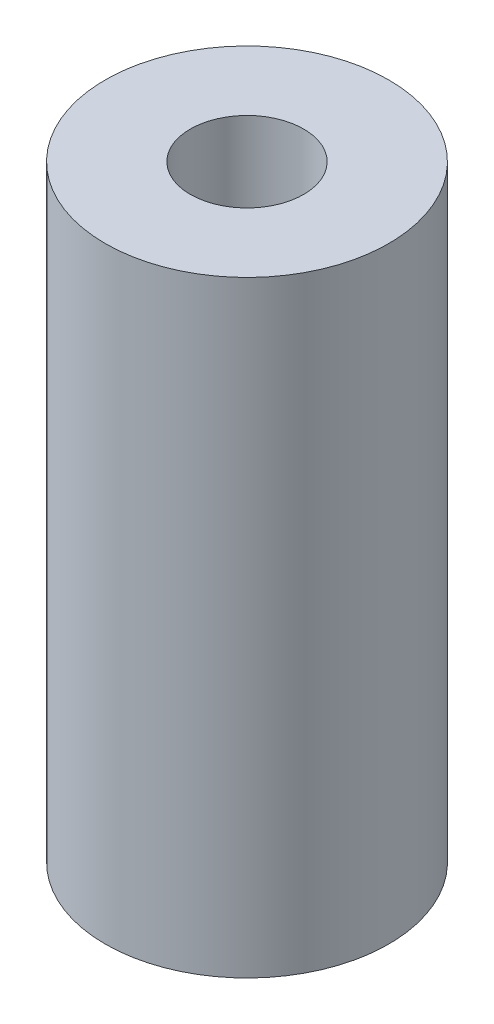
ISO-10303-21;
HEADER;
FILE_DESCRIPTION(('STEP AP214'),'2;1');
FILE_NAME('part.step','',(''),(''),'','','');
FILE_SCHEMA(('AUTOMOTIVE_DESIGN { 1 0 10303 214 1 1 1 1 }'));
ENDSEC;
DATA;
#1=APPLICATION_CONTEXT('core data for automotive mechanical design processes');
#2=APPLICATION_PROTOCOL_DEFINITION('international standard','automotive_design',2000,#1);
#3=PRODUCT_CONTEXT('',#1,'mechanical');
#4=PRODUCT('Part','Part','',(#3));
#5=PRODUCT_RELATED_PRODUCT_CATEGORY('part','',(#4));
#6=PRODUCT_DEFINITION_FORMATION('','',#4);
#7=PRODUCT_DEFINITION_CONTEXT('part definition',#1,'design');
#8=PRODUCT_DEFINITION('design','',#6,#7);
#9=PRODUCT_DEFINITION_SHAPE('','',#8);
#10=(LENGTH_UNIT() NAMED_UNIT(*) SI_UNIT(.MILLI.,.METRE.));
#11=(NAMED_UNIT(*) PLANE_ANGLE_UNIT() SI_UNIT($,.RADIAN.));
#12=(NAMED_UNIT(*) SI_UNIT($,.STERADIAN.) SOLID_ANGLE_UNIT());
#13=UNCERTAINTY_MEASURE_WITH_UNIT(LENGTH_MEASURE(1.E-05),#10,'distance_accuracy_value','');
#14=(GEOMETRIC_REPRESENTATION_CONTEXT(3) GLOBAL_UNCERTAINTY_ASSIGNED_CONTEXT((#13)) GLOBAL_UNIT_ASSIGNED_CONTEXT((#10,
#11,#12)) REPRESENTATION_CONTEXT('',''));
#15=CARTESIAN_POINT('',(0.,0.,0.));
#16=DIRECTION('',(0.,0.,1.));
#17=DIRECTION('',(1.,0.,0.));
#18=AXIS2_PLACEMENT_3D('',#15,#16,#17);
#19=CARTESIAN_POINT('',(0.,27.178,0.));
#20=DIRECTION('',(0.,1.,0.));
#21=DIRECTION('',(0.,0.,1.));
#22=AXIS2_PLACEMENT_3D('',#19,#20,#21);
#23=PLANE('',#22);
#24=CARTESIAN_POINT('',(0.,27.178,0.));
#25=DIRECTION('',(0.,1.,0.));
#26=DIRECTION('',(0.,0.,1.));
#27=AXIS2_PLACEMENT_3D('',#24,#25,#26);
#28=CIRCLE('',#27,6.35);
#29=CARTESIAN_POINT('',(0.,27.178,6.35));
#30=VERTEX_POINT('',#29);
#31=EDGE_CURVE('E10',#30,#30,#28,.T.);
#32=ORIENTED_EDGE('',*,*,#31,.T.);
#33=EDGE_LOOP('',(#32));
#34=FACE_BOUND('',#33,.T.);
#35=CARTESIAN_POINT('',(0.,27.178,0.));
#36=DIRECTION('',(0.,1.,0.));
#37=DIRECTION('',(0.,0.,1.));
#38=AXIS2_PLACEMENT_3D('',#35,#36,#37);
#39=CIRCLE('',#38,2.54);
#40=CARTESIAN_POINT('',(0.,27.178,2.54));
#41=VERTEX_POINT('',#40);
#42=EDGE_CURVE('E48',#41,#41,#39,.T.);
#43=ORIENTED_EDGE('',*,*,#42,.F.);
#44=EDGE_LOOP('',(#43));
#45=FACE_BOUND('',#44,.T.);
#46=ADVANCED_FACE('F37',(#34,#45),#23,.T.);
#47=CARTESIAN_POINT('',(0.,0.,0.));
#48=DIRECTION('',(0.,1.,0.));
#49=DIRECTION('',(0.,0.,1.));
#50=AXIS2_PLACEMENT_3D('',#47,#48,#49);
#51=PLANE('',#50);
#52=CARTESIAN_POINT('',(0.,0.,0.));
#53=DIRECTION('',(0.,1.,0.));
#54=DIRECTION('',(0.,0.,1.));
#55=AXIS2_PLACEMENT_3D('',#52,#53,#54);
#56=CIRCLE('',#55,6.35);
#57=CARTESIAN_POINT('',(0.,0.,6.35));
#58=VERTEX_POINT('',#57);
#59=EDGE_CURVE('E41',#58,#58,#56,.T.);
#60=ORIENTED_EDGE('',*,*,#59,.F.);
#61=EDGE_LOOP('',(#60));
#62=FACE_BOUND('',#61,.T.);
#63=CARTESIAN_POINT('',(0.,0.,0.));
#64=DIRECTION('',(0.,1.,0.));
#65=DIRECTION('',(0.,0.,1.));
#66=AXIS2_PLACEMENT_3D('',#63,#64,#65);
#67=CIRCLE('',#66,2.54);
#68=CARTESIAN_POINT('',(0.,0.,2.54));
#69=VERTEX_POINT('',#68);
#70=EDGE_CURVE('E50',#69,#69,#67,.T.);
#71=ORIENTED_EDGE('',*,*,#70,.T.);
#72=EDGE_LOOP('',(#71));
#73=FACE_BOUND('',#72,.T.);
#74=ADVANCED_FACE('F60',(#62,#73),#51,.F.);
#75=CARTESIAN_POINT('',(0.,27.178,0.));
#76=DIRECTION('',(0.,-1.,0.));
#77=DIRECTION('',(0.,0.,-1.));
#78=AXIS2_PLACEMENT_3D('',#75,#76,#77);
#79=CYLINDRICAL_SURFACE('',#78,6.35);
#80=ORIENTED_EDGE('',*,*,#31,.F.);
#81=EDGE_LOOP('',(#80));
#82=FACE_BOUND('',#81,.T.);
#83=ORIENTED_EDGE('',*,*,#59,.T.);
#84=EDGE_LOOP('',(#83));
#85=FACE_BOUND('',#84,.T.);
#86=ADVANCED_FACE('F39',(#82,#85),#79,.T.);
#87=CARTESIAN_POINT('',(0.,27.178,0.));
#88=DIRECTION('',(0.,-1.,0.));
#89=DIRECTION('',(0.,0.,-1.));
#90=AXIS2_PLACEMENT_3D('',#87,#88,#89);
#91=CYLINDRICAL_SURFACE('',#90,2.54);
#92=ORIENTED_EDGE('',*,*,#42,.T.);
#93=EDGE_LOOP('',(#92));
#94=FACE_BOUND('',#93,.T.);
#95=ORIENTED_EDGE('',*,*,#70,.F.);
#96=EDGE_LOOP('',(#95));
#97=FACE_BOUND('',#96,.T.);
#98=ADVANCED_FACE('F56',(#94,#97),#91,.F.);
#99=CLOSED_SHELL('',(#46,#74,#86,#98));
#100=MANIFOLD_SOLID_BREP('B2',#99);
#101=ADVANCED_BREP_SHAPE_REPRESENTATION('',(#18,#100),#14);
#102=SHAPE_DEFINITION_REPRESENTATION(#9,#101);
ENDSEC;
END-ISO-10303-21;
